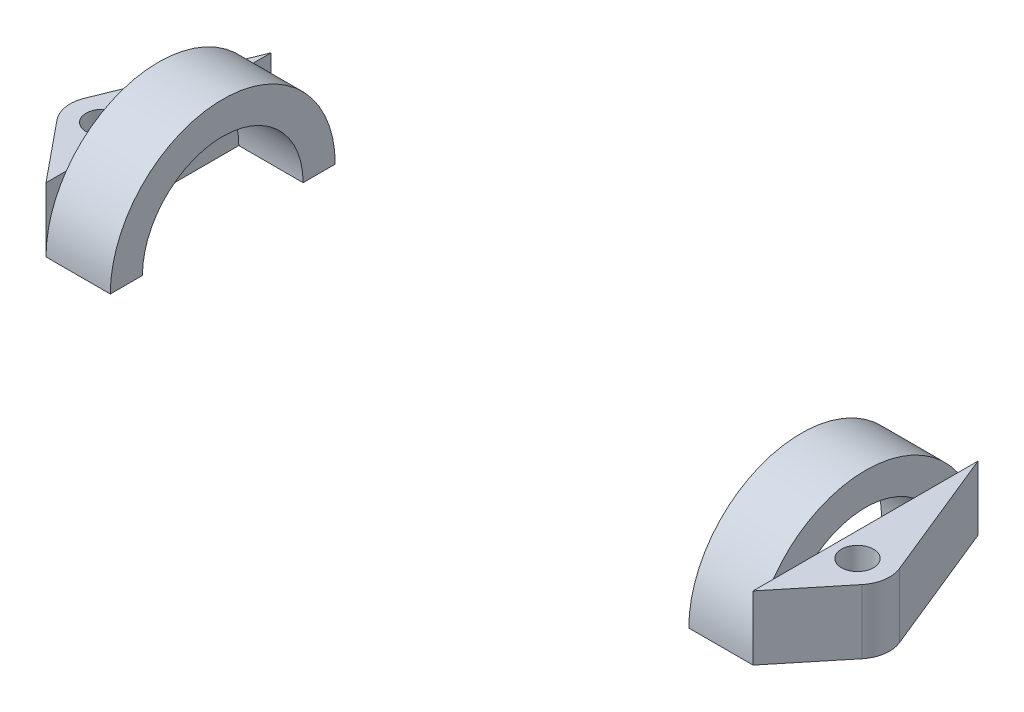
ISO-10303-21;
HEADER;
FILE_DESCRIPTION(('STEP AP214'),'2;1');
FILE_NAME('part.step','',(''),(''),'','','');
FILE_SCHEMA(('AUTOMOTIVE_DESIGN { 1 0 10303 214 1 1 1 1 }'));
ENDSEC;
DATA;
#1=APPLICATION_CONTEXT('core data for automotive mechanical design processes');
#2=APPLICATION_PROTOCOL_DEFINITION('international standard','automotive_design',2000,#1);
#3=PRODUCT_CONTEXT('',#1,'mechanical');
#4=PRODUCT('Part','Part','',(#3));
#5=PRODUCT_RELATED_PRODUCT_CATEGORY('part','',(#4));
#6=PRODUCT_DEFINITION_FORMATION('','',#4);
#7=PRODUCT_DEFINITION_CONTEXT('part definition',#1,'design');
#8=PRODUCT_DEFINITION('design','',#6,#7);
#9=PRODUCT_DEFINITION_SHAPE('','',#8);
#10=(LENGTH_UNIT() NAMED_UNIT(*) SI_UNIT(.MILLI.,.METRE.));
#11=(NAMED_UNIT(*) PLANE_ANGLE_UNIT() SI_UNIT($,.RADIAN.));
#12=(NAMED_UNIT(*) SI_UNIT($,.STERADIAN.) SOLID_ANGLE_UNIT());
#13=UNCERTAINTY_MEASURE_WITH_UNIT(LENGTH_MEASURE(1.E-05),#10,'distance_accuracy_value','');
#14=(GEOMETRIC_REPRESENTATION_CONTEXT(3) GLOBAL_UNCERTAINTY_ASSIGNED_CONTEXT((#13)) GLOBAL_UNIT_ASSIGNED_CONTEXT((#10,
#11,#12)) REPRESENTATION_CONTEXT('',''));
#15=CARTESIAN_POINT('',(0.,0.,0.));
#16=DIRECTION('',(0.,0.,1.));
#17=DIRECTION('',(1.,0.,0.));
#18=AXIS2_PLACEMENT_3D('',#15,#16,#17);
#19=CARTESIAN_POINT('',(22.,0.,0.));
#20=DIRECTION('',(0.,-1.,0.));
#21=DIRECTION('',(0.,0.,-1.));
#22=AXIS2_PLACEMENT_3D('',#19,#20,#21);
#23=PLANE('',#22);
#24=DIRECTION('',(0.,0.,1.));
#25=VECTOR('',#24,1.);
#26=CARTESIAN_POINT('',(20.,0.,5.));
#27=LINE('',#26,#25);
#28=CARTESIAN_POINT('',(20.,0.,-3.5));
#29=VERTEX_POINT('',#28);
#30=CARTESIAN_POINT('',(20.,0.,-2.5));
#31=VERTEX_POINT('',#30);
#32=EDGE_CURVE('E66',#29,#31,#27,.T.);
#33=ORIENTED_EDGE('',*,*,#32,.F.);
#34=DIRECTION('',(-1.,0.,0.));
#35=VECTOR('',#34,1.);
#36=CARTESIAN_POINT('',(22.,0.,-3.5));
#37=LINE('',#36,#35);
#38=CARTESIAN_POINT('',(22.,0.,-3.5));
#39=VERTEX_POINT('',#38);
#40=EDGE_CURVE('E150',#39,#29,#37,.T.);
#41=ORIENTED_EDGE('',*,*,#40,.F.);
#42=DIRECTION('',(-0.376617061394278,0.,-0.926369035032334));
#43=VECTOR('',#42,1.);
#44=CARTESIAN_POINT('',(22.,0.,-3.5));
#45=LINE('',#44,#43);
#46=CARTESIAN_POINT('',(23.6763690350323,0.,0.623382938605724));
#47=VERTEX_POINT('',#46);
#48=EDGE_CURVE('E196',#47,#39,#45,.T.);
#49=ORIENTED_EDGE('',*,*,#48,.F.);
#50=CARTESIAN_POINT('',(22.75,0.,1.));
#51=DIRECTION('',(0.,1.,0.));
#52=DIRECTION('',(0.,0.,-1.));
#53=AXIS2_PLACEMENT_3D('',#50,#51,#52);
#54=CIRCLE('',#53,1.);
#55=CARTESIAN_POINT('',(23.5246468588067,0.,1.63239405764201));
#56=VERTEX_POINT('',#55);
#57=EDGE_CURVE('E193',#56,#47,#54,.T.);
#58=ORIENTED_EDGE('',*,*,#57,.F.);
#59=DIRECTION('',(0.632394057642008,0.,-0.774646858806693));
#60=VECTOR('',#59,1.);
#61=CARTESIAN_POINT('',(22.,0.,3.5));
#62=LINE('',#61,#60);
#63=CARTESIAN_POINT('',(22.,0.,3.5));
#64=VERTEX_POINT('',#63);
#65=EDGE_CURVE('E190',#64,#56,#62,.T.);
#66=ORIENTED_EDGE('',*,*,#65,.F.);
#67=DIRECTION('',(-1.,0.,0.));
#68=VECTOR('',#67,1.);
#69=CARTESIAN_POINT('',(22.,0.,3.5));
#70=LINE('',#69,#68);
#71=CARTESIAN_POINT('',(20.,0.,3.5));
#72=VERTEX_POINT('',#71);
#73=EDGE_CURVE('E142',#64,#72,#70,.T.);
#74=ORIENTED_EDGE('',*,*,#73,.T.);
#75=CARTESIAN_POINT('',(20.,0.,2.5));
#76=VERTEX_POINT('',#75);
#77=EDGE_CURVE('E12',#76,#72,#27,.T.);
#78=ORIENTED_EDGE('',*,*,#77,.F.);
#79=DIRECTION('',(-1.,0.,0.));
#80=VECTOR('',#79,1.);
#81=CARTESIAN_POINT('',(22.,0.,2.5));
#82=LINE('',#81,#80);
#83=CARTESIAN_POINT('',(22.,0.,2.5));
#84=VERTEX_POINT('',#83);
#85=EDGE_CURVE('E135',#84,#76,#82,.T.);
#86=ORIENTED_EDGE('',*,*,#85,.F.);
#87=DIRECTION('',(0.,0.,1.));
#88=VECTOR('',#87,1.);
#89=CARTESIAN_POINT('',(22.,0.,-3.5));
#90=LINE('',#89,#88);
#91=CARTESIAN_POINT('',(22.,0.,-2.5));
#92=VERTEX_POINT('',#91);
#93=EDGE_CURVE('E140',#92,#84,#90,.T.);
#94=ORIENTED_EDGE('',*,*,#93,.F.);
#95=DIRECTION('',(-1.,0.,0.));
#96=VECTOR('',#95,1.);
#97=CARTESIAN_POINT('',(22.,0.,-2.5));
#98=LINE('',#97,#96);
#99=EDGE_CURVE('E59',#92,#31,#98,.T.);
#100=ORIENTED_EDGE('',*,*,#99,.T.);
#101=EDGE_LOOP('',(#33,#41,#49,#58,#66,#74,#78,#86,#94,#100));
#102=FACE_BOUND('',#101,.T.);
#103=CARTESIAN_POINT('',(22.75,0.,1.));
#104=DIRECTION('',(0.,1.,0.));
#105=DIRECTION('',(0.,0.,-1.));
#106=AXIS2_PLACEMENT_3D('',#103,#104,#105);
#107=CIRCLE('',#106,0.500000000000002);
#108=CARTESIAN_POINT('',(22.75,0.,0.499999999999999));
#109=VERTEX_POINT('',#108);
#110=EDGE_CURVE('E141',#109,#109,#107,.T.);
#111=ORIENTED_EDGE('',*,*,#110,.T.);
#112=EDGE_LOOP('',(#111));
#113=FACE_BOUND('',#112,.T.);
#114=ADVANCED_FACE('F55',(#102,#113),#23,.T.);
#115=CARTESIAN_POINT('',(22.,0.,0.));
#116=DIRECTION('',(-1.,0.,0.));
#117=DIRECTION('',(0.,0.,1.));
#118=AXIS2_PLACEMENT_3D('',#115,#116,#117);
#119=CYLINDRICAL_SURFACE('',#118,2.5);
#120=CARTESIAN_POINT('',(20.,0.,0.));
#121=DIRECTION('',(1.,0.,0.));
#122=DIRECTION('',(0.,0.,-1.));
#123=AXIS2_PLACEMENT_3D('',#120,#121,#122);
#124=CIRCLE('',#123,2.5);
#125=EDGE_CURVE('E64',#31,#76,#124,.T.);
#126=ORIENTED_EDGE('',*,*,#125,.F.);
#127=ORIENTED_EDGE('',*,*,#99,.F.);
#128=CARTESIAN_POINT('',(22.,0.,0.));
#129=DIRECTION('',(1.,0.,0.));
#130=DIRECTION('',(0.,0.,-1.));
#131=AXIS2_PLACEMENT_3D('',#128,#129,#130);
#132=CIRCLE('',#131,2.5);
#133=CARTESIAN_POINT('',(22.,2.,-1.5));
#134=VERTEX_POINT('',#133);
#135=EDGE_CURVE('E144',#92,#134,#132,.T.);
#136=ORIENTED_EDGE('',*,*,#135,.T.);
#137=CARTESIAN_POINT('',(22.,2.,1.5));
#138=VERTEX_POINT('',#137);
#139=EDGE_CURVE('E152',#134,#138,#132,.T.);
#140=ORIENTED_EDGE('',*,*,#139,.T.);
#141=EDGE_CURVE('E151',#138,#84,#132,.T.);
#142=ORIENTED_EDGE('',*,*,#141,.T.);
#143=ORIENTED_EDGE('',*,*,#85,.T.);
#144=EDGE_LOOP('',(#126,#127,#136,#140,#142,#143));
#145=FACE_BOUND('',#144,.T.);
#146=ADVANCED_FACE('F132',(#145),#119,.F.);
#147=CARTESIAN_POINT('',(22.,0.,0.));
#148=DIRECTION('',(-1.,0.,0.));
#149=DIRECTION('',(0.,0.,1.));
#150=AXIS2_PLACEMENT_3D('',#147,#148,#149);
#151=CYLINDRICAL_SURFACE('',#150,3.5);
#152=ORIENTED_EDGE('',*,*,#40,.T.);
#153=CARTESIAN_POINT('',(20.,0.,0.));
#154=DIRECTION('',(1.,0.,0.));
#155=DIRECTION('',(0.,0.,-1.));
#156=AXIS2_PLACEMENT_3D('',#153,#154,#155);
#157=CIRCLE('',#156,3.5);
#158=EDGE_CURVE('E72',#29,#72,#157,.T.);
#159=ORIENTED_EDGE('',*,*,#158,.T.);
#160=ORIENTED_EDGE('',*,*,#73,.F.);
#161=CARTESIAN_POINT('',(22.,0.,0.));
#162=DIRECTION('',(1.,0.,0.));
#163=DIRECTION('',(0.,0.,-1.));
#164=AXIS2_PLACEMENT_3D('',#161,#162,#163);
#165=CIRCLE('',#164,3.5);
#166=CARTESIAN_POINT('',(22.,2.,2.87228132326901));
#167=VERTEX_POINT('',#166);
#168=EDGE_CURVE('E178',#167,#64,#165,.T.);
#169=ORIENTED_EDGE('',*,*,#168,.F.);
#170=CARTESIAN_POINT('',(22.,2.,-2.87228132326901));
#171=VERTEX_POINT('',#170);
#172=EDGE_CURVE('E204',#171,#167,#165,.T.);
#173=ORIENTED_EDGE('',*,*,#172,.F.);
#174=EDGE_CURVE('E203',#39,#171,#165,.T.);
#175=ORIENTED_EDGE('',*,*,#174,.F.);
#176=EDGE_LOOP('',(#152,#159,#160,#169,#173,#175));
#177=FACE_BOUND('',#176,.T.);
#178=ADVANCED_FACE('F57',(#177),#151,.T.);
#179=CARTESIAN_POINT('',(22.,0.,0.));
#180=DIRECTION('',(1.,0.,0.));
#181=DIRECTION('',(0.,0.,-1.));
#182=AXIS2_PLACEMENT_3D('',#179,#180,#181);
#183=PLANE('',#182);
#184=DIRECTION('',(0.,0.,1.));
#185=VECTOR('',#184,1.);
#186=CARTESIAN_POINT('',(22.,2.,-3.5));
#187=LINE('',#186,#185);
#188=EDGE_CURVE('E163',#171,#134,#187,.T.);
#189=ORIENTED_EDGE('',*,*,#188,.F.);
#190=ORIENTED_EDGE('',*,*,#172,.T.);
#191=EDGE_CURVE('E166',#138,#167,#187,.T.);
#192=ORIENTED_EDGE('',*,*,#191,.F.);
#193=ORIENTED_EDGE('',*,*,#139,.F.);
#194=EDGE_LOOP('',(#189,#190,#192,#193));
#195=FACE_BOUND('',#194,.T.);
#196=ADVANCED_FACE('F161',(#195),#183,.T.);
#197=CARTESIAN_POINT('',(22.,2.,-3.5));
#198=DIRECTION('',(1.,0.,0.));
#199=DIRECTION('',(0.,0.,-1.));
#200=AXIS2_PLACEMENT_3D('',#197,#198,#199);
#201=PLANE('',#200);
#202=DIRECTION('',(0.,-1.,0.));
#203=VECTOR('',#202,1.);
#204=CARTESIAN_POINT('',(22.,2.,-3.5));
#205=LINE('',#204,#203);
#206=CARTESIAN_POINT('',(22.,2.,-3.5));
#207=VERTEX_POINT('',#206);
#208=EDGE_CURVE('E200',#207,#39,#205,.T.);
#209=ORIENTED_EDGE('',*,*,#208,.T.);
#210=ORIENTED_EDGE('',*,*,#174,.T.);
#211=EDGE_CURVE('E177',#207,#171,#187,.T.);
#212=ORIENTED_EDGE('',*,*,#211,.F.);
#213=EDGE_LOOP('',(#209,#210,#212));
#214=FACE_BOUND('',#213,.T.);
#215=ADVANCED_FACE('F231',(#214),#201,.F.);
#216=CARTESIAN_POINT('',(22.,2.,3.5));
#217=VERTEX_POINT('',#216);
#218=EDGE_CURVE('E172',#167,#217,#187,.T.);
#219=ORIENTED_EDGE('',*,*,#218,.F.);
#220=ORIENTED_EDGE('',*,*,#168,.T.);
#221=DIRECTION('',(0.,-1.,0.));
#222=VECTOR('',#221,1.);
#223=CARTESIAN_POINT('',(22.,2.,3.5));
#224=LINE('',#223,#222);
#225=EDGE_CURVE('E192',#217,#64,#224,.T.);
#226=ORIENTED_EDGE('',*,*,#225,.F.);
#227=EDGE_LOOP('',(#219,#220,#226));
#228=FACE_BOUND('',#227,.T.);
#229=ADVANCED_FACE('F217',(#228),#201,.F.);
#230=CARTESIAN_POINT('',(22.75,2.,1.));
#231=DIRECTION('',(0.,-1.,0.));
#232=DIRECTION('',(0.,0.,-1.));
#233=AXIS2_PLACEMENT_3D('',#230,#231,#232);
#234=PLANE('',#233);
#235=ORIENTED_EDGE('',*,*,#211,.T.);
#236=ORIENTED_EDGE('',*,*,#188,.T.);
#237=EDGE_CURVE('E168',#134,#138,#187,.T.);
#238=ORIENTED_EDGE('',*,*,#237,.T.);
#239=ORIENTED_EDGE('',*,*,#191,.T.);
#240=ORIENTED_EDGE('',*,*,#218,.T.);
#241=DIRECTION('',(0.632394057642008,0.,-0.774646858806693));
#242=VECTOR('',#241,1.);
#243=CARTESIAN_POINT('',(22.,2.,3.5));
#244=LINE('',#243,#242);
#245=CARTESIAN_POINT('',(23.5246468588067,2.,1.63239405764201));
#246=VERTEX_POINT('',#245);
#247=EDGE_CURVE('E180',#217,#246,#244,.T.);
#248=ORIENTED_EDGE('',*,*,#247,.T.);
#249=CARTESIAN_POINT('',(22.75,2.,1.));
#250=DIRECTION('',(0.,1.,0.));
#251=DIRECTION('',(0.,0.,-1.));
#252=AXIS2_PLACEMENT_3D('',#249,#250,#251);
#253=CIRCLE('',#252,1.);
#254=CARTESIAN_POINT('',(23.6763690350323,2.,0.623382938605724));
#255=VERTEX_POINT('',#254);
#256=EDGE_CURVE('E183',#246,#255,#253,.T.);
#257=ORIENTED_EDGE('',*,*,#256,.T.);
#258=DIRECTION('',(-0.376617061394278,0.,-0.926369035032334));
#259=VECTOR('',#258,1.);
#260=CARTESIAN_POINT('',(22.,2.,-3.5));
#261=LINE('',#260,#259);
#262=EDGE_CURVE('E185',#255,#207,#261,.T.);
#263=ORIENTED_EDGE('',*,*,#262,.T.);
#264=EDGE_LOOP('',(#235,#236,#238,#239,#240,#248,#257,#263));
#265=FACE_BOUND('',#264,.T.);
#266=CARTESIAN_POINT('',(22.75,2.,1.));
#267=DIRECTION('',(0.,1.,0.));
#268=DIRECTION('',(0.,0.,-1.));
#269=AXIS2_PLACEMENT_3D('',#266,#267,#268);
#270=CIRCLE('',#269,0.500000000000002);
#271=CARTESIAN_POINT('',(22.75,2.,0.499999999999999));
#272=VERTEX_POINT('',#271);
#273=EDGE_CURVE('E129',#272,#272,#270,.T.);
#274=ORIENTED_EDGE('',*,*,#273,.F.);
#275=EDGE_LOOP('',(#274));
#276=FACE_BOUND('',#275,.T.);
#277=ADVANCED_FACE('F174',(#265,#276),#234,.F.);
#278=ORIENTED_EDGE('',*,*,#135,.F.);
#279=ORIENTED_EDGE('',*,*,#93,.T.);
#280=ORIENTED_EDGE('',*,*,#141,.F.);
#281=ORIENTED_EDGE('',*,*,#237,.F.);
#282=EDGE_LOOP('',(#278,#279,#280,#281));
#283=FACE_BOUND('',#282,.T.);
#284=ADVANCED_FACE('F169',(#283),#201,.F.);
#285=CARTESIAN_POINT('',(22.,2.,3.5));
#286=DIRECTION('',(-0.774646858806693,0.,-0.632394057642008));
#287=DIRECTION('',(-0.632394057642008,0.,0.774646858806693));
#288=AXIS2_PLACEMENT_3D('',#285,#286,#287);
#289=PLANE('',#288);
#290=ORIENTED_EDGE('',*,*,#65,.T.);
#291=DIRECTION('',(0.,-1.,0.));
#292=VECTOR('',#291,1.);
#293=CARTESIAN_POINT('',(23.5246468588067,2.,1.63239405764201));
#294=LINE('',#293,#292);
#295=EDGE_CURVE('E195',#246,#56,#294,.T.);
#296=ORIENTED_EDGE('',*,*,#295,.F.);
#297=ORIENTED_EDGE('',*,*,#247,.F.);
#298=ORIENTED_EDGE('',*,*,#225,.T.);
#299=EDGE_LOOP('',(#290,#296,#297,#298));
#300=FACE_BOUND('',#299,.T.);
#301=ADVANCED_FACE('F221',(#300),#289,.F.);
#302=CARTESIAN_POINT('',(22.75,2.,1.));
#303=DIRECTION('',(0.,-1.,0.));
#304=DIRECTION('',(0.,0.,-1.));
#305=AXIS2_PLACEMENT_3D('',#302,#303,#304);
#306=CYLINDRICAL_SURFACE('',#305,1.);
#307=ORIENTED_EDGE('',*,*,#57,.T.);
#308=DIRECTION('',(0.,-1.,0.));
#309=VECTOR('',#308,1.);
#310=CARTESIAN_POINT('',(23.6763690350323,2.,0.623382938605724));
#311=LINE('',#310,#309);
#312=EDGE_CURVE('E199',#255,#47,#311,.T.);
#313=ORIENTED_EDGE('',*,*,#312,.F.);
#314=ORIENTED_EDGE('',*,*,#256,.F.);
#315=ORIENTED_EDGE('',*,*,#295,.T.);
#316=EDGE_LOOP('',(#307,#313,#314,#315));
#317=FACE_BOUND('',#316,.T.);
#318=ADVANCED_FACE('F225',(#317),#306,.T.);
#319=CARTESIAN_POINT('',(22.,2.,-3.5));
#320=DIRECTION('',(-0.926369035032334,0.,0.376617061394278));
#321=DIRECTION('',(0.376617061394278,0.,0.926369035032334));
#322=AXIS2_PLACEMENT_3D('',#319,#320,#321);
#323=PLANE('',#322);
#324=ORIENTED_EDGE('',*,*,#48,.T.);
#325=ORIENTED_EDGE('',*,*,#208,.F.);
#326=ORIENTED_EDGE('',*,*,#262,.F.);
#327=ORIENTED_EDGE('',*,*,#312,.T.);
#328=EDGE_LOOP('',(#324,#325,#326,#327));
#329=FACE_BOUND('',#328,.T.);
#330=ADVANCED_FACE('F229',(#329),#323,.F.);
#331=CARTESIAN_POINT('',(22.75,2.,1.));
#332=DIRECTION('',(0.,-1.,0.));
#333=DIRECTION('',(0.,0.,-1.));
#334=AXIS2_PLACEMENT_3D('',#331,#332,#333);
#335=CYLINDRICAL_SURFACE('',#334,0.500000000000002);
#336=ORIENTED_EDGE('',*,*,#273,.T.);
#337=EDGE_LOOP('',(#336));
#338=FACE_BOUND('',#337,.T.);
#339=ORIENTED_EDGE('',*,*,#110,.F.);
#340=EDGE_LOOP('',(#339));
#341=FACE_BOUND('',#340,.T.);
#342=ADVANCED_FACE('F245',(#338,#341),#335,.F.);
#343=CARTESIAN_POINT('',(20.,3.5,5.));
#344=DIRECTION('',(1.,0.,0.));
#345=DIRECTION('',(0.,0.,-1.));
#346=AXIS2_PLACEMENT_3D('',#343,#344,#345);
#347=PLANE('',#346);
#348=ORIENTED_EDGE('',*,*,#32,.T.);
#349=ORIENTED_EDGE('',*,*,#125,.T.);
#350=ORIENTED_EDGE('',*,*,#77,.T.);
#351=ORIENTED_EDGE('',*,*,#158,.F.);
#352=EDGE_LOOP('',(#348,#349,#350,#351));
#353=FACE_BOUND('',#352,.T.);
#354=ADVANCED_FACE('F124',(#353),#347,.F.);
#355=CLOSED_SHELL('',(#114,#146,#178,#196,#215,#229,#277,#284,#301,#318,#330,#342,#354));
#356=MANIFOLD_SOLID_BREP('B2',#355);
#357=CARTESIAN_POINT('',(-0.75,2.,1.));
#358=DIRECTION('',(0.,1.,0.));
#359=DIRECTION('',(0.,0.,1.));
#360=AXIS2_PLACEMENT_3D('',#357,#358,#359);
#361=PLANE('',#360);
#362=DIRECTION('',(0.,0.,-1.));
#363=VECTOR('',#362,1.);
#364=CARTESIAN_POINT('',(0.,2.,-3.5));
#365=LINE('',#364,#363);
#366=CARTESIAN_POINT('',(0.,2.,3.5));
#367=VERTEX_POINT('',#366);
#368=CARTESIAN_POINT('',(0.,2.,2.87228132326901));
#369=VERTEX_POINT('',#368);
#370=EDGE_CURVE('E484',#367,#369,#365,.T.);
#371=ORIENTED_EDGE('',*,*,#370,.T.);
#372=CARTESIAN_POINT('',(0.,2.,1.5));
#373=VERTEX_POINT('',#372);
#374=EDGE_CURVE('E358',#369,#373,#365,.T.);
#375=ORIENTED_EDGE('',*,*,#374,.T.);
#376=CARTESIAN_POINT('',(0.,2.,-1.5));
#377=VERTEX_POINT('',#376);
#378=EDGE_CURVE('E487',#373,#377,#365,.T.);
#379=ORIENTED_EDGE('',*,*,#378,.T.);
#380=CARTESIAN_POINT('',(0.,2.,-2.87228132326901));
#381=VERTEX_POINT('',#380);
#382=EDGE_CURVE('E442',#377,#381,#365,.T.);
#383=ORIENTED_EDGE('',*,*,#382,.T.);
#384=CARTESIAN_POINT('',(0.,2.,-3.5));
#385=VERTEX_POINT('',#384);
#386=EDGE_CURVE('E470',#381,#385,#365,.T.);
#387=ORIENTED_EDGE('',*,*,#386,.T.);
#388=DIRECTION('',(-0.376617061394278,0.,0.926369035032335));
#389=VECTOR('',#388,1.);
#390=CARTESIAN_POINT('',(0.,2.,-3.5));
#391=LINE('',#390,#389);
#392=CARTESIAN_POINT('',(-1.67636903503233,2.,0.623382938605722));
#393=VERTEX_POINT('',#392);
#394=EDGE_CURVE('E482',#385,#393,#391,.T.);
#395=ORIENTED_EDGE('',*,*,#394,.T.);
#396=CARTESIAN_POINT('',(-0.75,2.,1.));
#397=DIRECTION('',(0.,1.,0.));
#398=DIRECTION('',(0.,0.,1.));
#399=AXIS2_PLACEMENT_3D('',#396,#397,#398);
#400=CIRCLE('',#399,1.);
#401=CARTESIAN_POINT('',(-1.52464685880669,2.,1.63239405764201));
#402=VERTEX_POINT('',#401);
#403=EDGE_CURVE('E480',#393,#402,#400,.T.);
#404=ORIENTED_EDGE('',*,*,#403,.T.);
#405=DIRECTION('',(0.632394057642008,0.,0.774646858806693));
#406=VECTOR('',#405,1.);
#407=CARTESIAN_POINT('',(0.,2.,3.5));
#408=LINE('',#407,#406);
#409=EDGE_CURVE('E467',#402,#367,#408,.T.);
#410=ORIENTED_EDGE('',*,*,#409,.T.);
#411=EDGE_LOOP('',(#371,#375,#379,#383,#387,#395,#404,#410));
#412=FACE_BOUND('',#411,.T.);
#413=CARTESIAN_POINT('',(-0.75,2.,1.));
#414=DIRECTION('',(0.,1.,0.));
#415=DIRECTION('',(0.,0.,1.));
#416=AXIS2_PLACEMENT_3D('',#413,#414,#415);
#417=CIRCLE('',#416,0.5);
#418=CARTESIAN_POINT('',(-0.75,2.,1.5));
#419=VERTEX_POINT('',#418);
#420=EDGE_CURVE('E478',#419,#419,#417,.T.);
#421=ORIENTED_EDGE('',*,*,#420,.F.);
#422=EDGE_LOOP('',(#421));
#423=FACE_BOUND('',#422,.T.);
#424=ADVANCED_FACE('F350',(#412,#423),#361,.T.);
#425=CARTESIAN_POINT('',(0.,2.,-3.5));
#426=DIRECTION('',(-1.,0.,0.));
#427=DIRECTION('',(0.,0.,1.));
#428=AXIS2_PLACEMENT_3D('',#425,#426,#427);
#429=PLANE('',#428);
#430=CARTESIAN_POINT('',(0.,0.,0.));
#431=DIRECTION('',(1.,0.,0.));
#432=DIRECTION('',(0.,0.,-1.));
#433=AXIS2_PLACEMENT_3D('',#430,#431,#432);
#434=CIRCLE('',#433,3.5);
#435=CARTESIAN_POINT('',(0.,0.,3.5));
#436=VERTEX_POINT('',#435);
#437=EDGE_CURVE('E438',#369,#436,#434,.T.);
#438=ORIENTED_EDGE('',*,*,#437,.F.);
#439=ORIENTED_EDGE('',*,*,#370,.F.);
#440=DIRECTION('',(0.,-1.,0.));
#441=VECTOR('',#440,1.);
#442=CARTESIAN_POINT('',(0.,2.,3.5));
#443=LINE('',#442,#441);
#444=EDGE_CURVE('E464',#367,#436,#443,.T.);
#445=ORIENTED_EDGE('',*,*,#444,.T.);
#446=EDGE_LOOP('',(#438,#439,#445));
#447=FACE_BOUND('',#446,.T.);
#448=ADVANCED_FACE('F497',(#447),#429,.F.);
#449=CARTESIAN_POINT('',(0.,0.,-3.5));
#450=VERTEX_POINT('',#449);
#451=EDGE_CURVE('E452',#450,#381,#434,.T.);
#452=ORIENTED_EDGE('',*,*,#451,.F.);
#453=DIRECTION('',(0.,-1.,0.));
#454=VECTOR('',#453,1.);
#455=CARTESIAN_POINT('',(0.,2.,-3.5));
#456=LINE('',#455,#454);
#457=EDGE_CURVE('E455',#385,#450,#456,.T.);
#458=ORIENTED_EDGE('',*,*,#457,.F.);
#459=ORIENTED_EDGE('',*,*,#386,.F.);
#460=EDGE_LOOP('',(#452,#458,#459));
#461=FACE_BOUND('',#460,.T.);
#462=ADVANCED_FACE('F504',(#461),#429,.F.);
#463=CARTESIAN_POINT('',(-0.75,2.,1.));
#464=DIRECTION('',(0.,-1.,0.));
#465=DIRECTION('',(0.,0.,-1.));
#466=AXIS2_PLACEMENT_3D('',#463,#464,#465);
#467=CYLINDRICAL_SURFACE('',#466,0.5);
#468=ORIENTED_EDGE('',*,*,#420,.T.);
#469=EDGE_LOOP('',(#468));
#470=FACE_BOUND('',#469,.T.);
#471=CARTESIAN_POINT('',(-0.75,0.,1.));
#472=DIRECTION('',(0.,1.,0.));
#473=DIRECTION('',(0.,0.,1.));
#474=AXIS2_PLACEMENT_3D('',#471,#472,#473);
#475=CIRCLE('',#474,0.5);
#476=CARTESIAN_POINT('',(-0.75,0.,1.5));
#477=VERTEX_POINT('',#476);
#478=EDGE_CURVE('E425',#477,#477,#475,.T.);
#479=ORIENTED_EDGE('',*,*,#478,.F.);
#480=EDGE_LOOP('',(#479));
#481=FACE_BOUND('',#480,.T.);
#482=ADVANCED_FACE('F493',(#470,#481),#467,.F.);
#483=CARTESIAN_POINT('',(0.,2.,-3.5));
#484=DIRECTION('',(0.926369035032335,0.,0.376617061394278));
#485=DIRECTION('',(0.376617061394278,0.,-0.926369035032335));
#486=AXIS2_PLACEMENT_3D('',#483,#484,#485);
#487=PLANE('',#486);
#488=DIRECTION('',(-0.376617061394278,0.,0.926369035032335));
#489=VECTOR('',#488,1.);
#490=CARTESIAN_POINT('',(0.,0.,-3.5));
#491=LINE('',#490,#489);
#492=CARTESIAN_POINT('',(-1.67636903503233,0.,0.623382938605722));
#493=VERTEX_POINT('',#492);
#494=EDGE_CURVE('E473',#450,#493,#491,.T.);
#495=ORIENTED_EDGE('',*,*,#494,.T.);
#496=DIRECTION('',(0.,-1.,0.));
#497=VECTOR('',#496,1.);
#498=CARTESIAN_POINT('',(-1.67636903503233,2.,0.623382938605722));
#499=LINE('',#498,#497);
#500=EDGE_CURVE('E458',#393,#493,#499,.T.);
#501=ORIENTED_EDGE('',*,*,#500,.F.);
#502=ORIENTED_EDGE('',*,*,#394,.F.);
#503=ORIENTED_EDGE('',*,*,#457,.T.);
#504=EDGE_LOOP('',(#495,#501,#502,#503));
#505=FACE_BOUND('',#504,.T.);
#506=ADVANCED_FACE('F519',(#505),#487,.F.);
#507=CARTESIAN_POINT('',(-0.75,2.,1.));
#508=DIRECTION('',(0.,-1.,0.));
#509=DIRECTION('',(0.,0.,-1.));
#510=AXIS2_PLACEMENT_3D('',#507,#508,#509);
#511=CYLINDRICAL_SURFACE('',#510,1.);
#512=CARTESIAN_POINT('',(-0.75,0.,1.));
#513=DIRECTION('',(0.,1.,0.));
#514=DIRECTION('',(0.,0.,1.));
#515=AXIS2_PLACEMENT_3D('',#512,#513,#514);
#516=CIRCLE('',#515,1.);
#517=CARTESIAN_POINT('',(-1.52464685880669,0.,1.63239405764201));
#518=VERTEX_POINT('',#517);
#519=EDGE_CURVE('E471',#493,#518,#516,.T.);
#520=ORIENTED_EDGE('',*,*,#519,.T.);
#521=DIRECTION('',(0.,-1.,0.));
#522=VECTOR('',#521,1.);
#523=CARTESIAN_POINT('',(-1.52464685880669,2.,1.63239405764201));
#524=LINE('',#523,#522);
#525=EDGE_CURVE('E461',#402,#518,#524,.T.);
#526=ORIENTED_EDGE('',*,*,#525,.F.);
#527=ORIENTED_EDGE('',*,*,#403,.F.);
#528=ORIENTED_EDGE('',*,*,#500,.T.);
#529=EDGE_LOOP('',(#520,#526,#527,#528));
#530=FACE_BOUND('',#529,.T.);
#531=ADVANCED_FACE('F515',(#530),#511,.T.);
#532=CARTESIAN_POINT('',(0.,2.,3.5));
#533=DIRECTION('',(0.774646858806693,0.,-0.632394057642008));
#534=DIRECTION('',(-0.632394057642008,0.,-0.774646858806693));
#535=AXIS2_PLACEMENT_3D('',#532,#533,#534);
#536=PLANE('',#535);
#537=DIRECTION('',(0.632394057642008,0.,0.774646858806693));
#538=VECTOR('',#537,1.);
#539=CARTESIAN_POINT('',(0.,0.,3.5));
#540=LINE('',#539,#538);
#541=EDGE_CURVE('E468',#518,#436,#540,.T.);
#542=ORIENTED_EDGE('',*,*,#541,.T.);
#543=ORIENTED_EDGE('',*,*,#444,.F.);
#544=ORIENTED_EDGE('',*,*,#409,.F.);
#545=ORIENTED_EDGE('',*,*,#525,.T.);
#546=EDGE_LOOP('',(#542,#543,#544,#545));
#547=FACE_BOUND('',#546,.T.);
#548=ADVANCED_FACE('F511',(#547),#536,.F.);
#549=CARTESIAN_POINT('',(0.,0.,0.));
#550=DIRECTION('',(1.,0.,0.));
#551=DIRECTION('',(0.,0.,-1.));
#552=AXIS2_PLACEMENT_3D('',#549,#550,#551);
#553=PLANE('',#552);
#554=ORIENTED_EDGE('',*,*,#374,.F.);
#555=EDGE_CURVE('E454',#381,#369,#434,.T.);
#556=ORIENTED_EDGE('',*,*,#555,.F.);
#557=ORIENTED_EDGE('',*,*,#382,.F.);
#558=CARTESIAN_POINT('',(0.,0.,0.));
#559=DIRECTION('',(1.,0.,0.));
#560=DIRECTION('',(0.,0.,-1.));
#561=AXIS2_PLACEMENT_3D('',#558,#559,#560);
#562=CIRCLE('',#561,2.5);
#563=EDGE_CURVE('E450',#377,#373,#562,.T.);
#564=ORIENTED_EDGE('',*,*,#563,.T.);
#565=EDGE_LOOP('',(#554,#556,#557,#564));
#566=FACE_BOUND('',#565,.T.);
#567=ADVANCED_FACE('F514',(#566),#553,.F.);
#568=DIRECTION('',(0.,0.,-1.));
#569=VECTOR('',#568,1.);
#570=CARTESIAN_POINT('',(0.,0.,-3.5));
#571=LINE('',#570,#569);
#572=CARTESIAN_POINT('',(0.,0.,2.5));
#573=VERTEX_POINT('',#572);
#574=CARTESIAN_POINT('',(0.,0.,-2.5));
#575=VERTEX_POINT('',#574);
#576=EDGE_CURVE('E475',#573,#575,#571,.T.);
#577=ORIENTED_EDGE('',*,*,#576,.T.);
#578=EDGE_CURVE('E447',#575,#377,#562,.T.);
#579=ORIENTED_EDGE('',*,*,#578,.T.);
#580=ORIENTED_EDGE('',*,*,#378,.F.);
#581=EDGE_CURVE('E451',#373,#573,#562,.T.);
#582=ORIENTED_EDGE('',*,*,#581,.T.);
#583=EDGE_LOOP('',(#577,#579,#580,#582));
#584=FACE_BOUND('',#583,.T.);
#585=ADVANCED_FACE('F507',(#584),#429,.F.);
#586=CARTESIAN_POINT('',(22.,0.,0.));
#587=DIRECTION('',(-1.,0.,0.));
#588=DIRECTION('',(0.,0.,1.));
#589=AXIS2_PLACEMENT_3D('',#586,#587,#588);
#590=CYLINDRICAL_SURFACE('',#589,2.5);
#591=CARTESIAN_POINT('',(2.,0.,0.));
#592=DIRECTION('',(-1.,0.,0.));
#593=DIRECTION('',(0.,0.,1.));
#594=AXIS2_PLACEMENT_3D('',#591,#592,#593);
#595=CIRCLE('',#594,2.5);
#596=CARTESIAN_POINT('',(2.,0.,2.5));
#597=VERTEX_POINT('',#596);
#598=CARTESIAN_POINT('',(2.,0.,-2.5));
#599=VERTEX_POINT('',#598);
#600=EDGE_CURVE('E53',#597,#599,#595,.T.);
#601=ORIENTED_EDGE('',*,*,#600,.F.);
#602=DIRECTION('',(-1.,0.,0.));
#603=VECTOR('',#602,1.);
#604=CARTESIAN_POINT('',(22.,0.,2.5));
#605=LINE('',#604,#603);
#606=EDGE_CURVE('E435',#597,#573,#605,.T.);
#607=ORIENTED_EDGE('',*,*,#606,.T.);
#608=ORIENTED_EDGE('',*,*,#581,.F.);
#609=ORIENTED_EDGE('',*,*,#563,.F.);
#610=ORIENTED_EDGE('',*,*,#578,.F.);
#611=DIRECTION('',(-1.,0.,0.));
#612=VECTOR('',#611,1.);
#613=CARTESIAN_POINT('',(22.,0.,-2.5));
#614=LINE('',#613,#612);
#615=EDGE_CURVE('E443',#599,#575,#614,.T.);
#616=ORIENTED_EDGE('',*,*,#615,.F.);
#617=EDGE_LOOP('',(#601,#607,#608,#609,#610,#616));
#618=FACE_BOUND('',#617,.T.);
#619=ADVANCED_FACE('F526',(#618),#590,.F.);
#620=CARTESIAN_POINT('',(22.,0.,0.));
#621=DIRECTION('',(0.,-1.,0.));
#622=DIRECTION('',(0.,0.,-1.));
#623=AXIS2_PLACEMENT_3D('',#620,#621,#622);
#624=PLANE('',#623);
#625=DIRECTION('',(0.,0.,-1.));
#626=VECTOR('',#625,1.);
#627=CARTESIAN_POINT('',(2.,0.,5.));
#628=LINE('',#627,#626);
#629=CARTESIAN_POINT('',(2.,0.,3.5));
#630=VERTEX_POINT('',#629);
#631=EDGE_CURVE('E364',#630,#597,#628,.T.);
#632=ORIENTED_EDGE('',*,*,#631,.F.);
#633=DIRECTION('',(-1.,0.,0.));
#634=VECTOR('',#633,1.);
#635=CARTESIAN_POINT('',(22.,0.,3.5));
#636=LINE('',#635,#634);
#637=EDGE_CURVE('E432',#630,#436,#636,.T.);
#638=ORIENTED_EDGE('',*,*,#637,.T.);
#639=ORIENTED_EDGE('',*,*,#541,.F.);
#640=ORIENTED_EDGE('',*,*,#519,.F.);
#641=ORIENTED_EDGE('',*,*,#494,.F.);
#642=DIRECTION('',(-1.,0.,0.));
#643=VECTOR('',#642,1.);
#644=CARTESIAN_POINT('',(22.,0.,-3.5));
#645=LINE('',#644,#643);
#646=CARTESIAN_POINT('',(2.,0.,-3.5));
#647=VERTEX_POINT('',#646);
#648=EDGE_CURVE('E440',#647,#450,#645,.T.);
#649=ORIENTED_EDGE('',*,*,#648,.F.);
#650=EDGE_CURVE('E421',#599,#647,#628,.T.);
#651=ORIENTED_EDGE('',*,*,#650,.F.);
#652=ORIENTED_EDGE('',*,*,#615,.T.);
#653=ORIENTED_EDGE('',*,*,#576,.F.);
#654=ORIENTED_EDGE('',*,*,#606,.F.);
#655=EDGE_LOOP('',(#632,#638,#639,#640,#641,#649,#651,#652,#653,#654));
#656=FACE_BOUND('',#655,.T.);
#657=ORIENTED_EDGE('',*,*,#478,.T.);
#658=EDGE_LOOP('',(#657));
#659=FACE_BOUND('',#658,.T.);
#660=ADVANCED_FACE('F429',(#656,#659),#624,.T.);
#661=CARTESIAN_POINT('',(22.,0.,0.));
#662=DIRECTION('',(-1.,0.,0.));
#663=DIRECTION('',(0.,0.,1.));
#664=AXIS2_PLACEMENT_3D('',#661,#662,#663);
#665=CYLINDRICAL_SURFACE('',#664,3.5);
#666=ORIENTED_EDGE('',*,*,#637,.F.);
#667=CARTESIAN_POINT('',(2.,0.,0.));
#668=DIRECTION('',(-1.,0.,0.));
#669=DIRECTION('',(0.,0.,1.));
#670=AXIS2_PLACEMENT_3D('',#667,#668,#669);
#671=CIRCLE('',#670,3.5);
#672=EDGE_CURVE('E418',#630,#647,#671,.T.);
#673=ORIENTED_EDGE('',*,*,#672,.T.);
#674=ORIENTED_EDGE('',*,*,#648,.T.);
#675=ORIENTED_EDGE('',*,*,#451,.T.);
#676=ORIENTED_EDGE('',*,*,#555,.T.);
#677=ORIENTED_EDGE('',*,*,#437,.T.);
#678=EDGE_LOOP('',(#666,#673,#674,#675,#676,#677));
#679=FACE_BOUND('',#678,.T.);
#680=ADVANCED_FACE('F352',(#679),#665,.T.);
#681=CARTESIAN_POINT('',(2.,3.5,5.));
#682=DIRECTION('',(-1.,0.,0.));
#683=DIRECTION('',(0.,0.,1.));
#684=AXIS2_PLACEMENT_3D('',#681,#682,#683);
#685=PLANE('',#684);
#686=ORIENTED_EDGE('',*,*,#631,.T.);
#687=ORIENTED_EDGE('',*,*,#600,.T.);
#688=ORIENTED_EDGE('',*,*,#650,.T.);
#689=ORIENTED_EDGE('',*,*,#672,.F.);
#690=EDGE_LOOP('',(#686,#687,#688,#689));
#691=FACE_BOUND('',#690,.T.);
#692=ADVANCED_FACE('F419',(#691),#685,.F.);
#693=CLOSED_SHELL('',(#424,#448,#462,#482,#506,#531,#548,#567,#585,#619,#660,#680,#692));
#694=MANIFOLD_SOLID_BREP('B6',#693);
#695=ADVANCED_BREP_SHAPE_REPRESENTATION('',(#18,#356,#694),#14);
#696=SHAPE_DEFINITION_REPRESENTATION(#9,#695);
ENDSEC;
END-ISO-10303-21;
